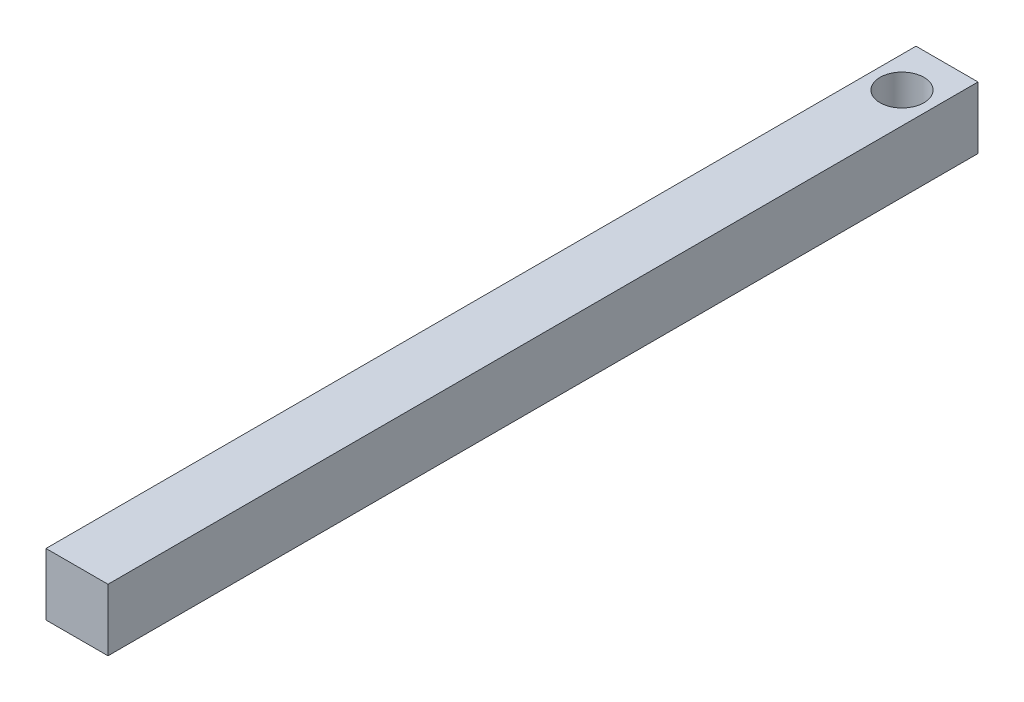
ISO-10303-21;
HEADER;
FILE_DESCRIPTION(('STEP AP214'),'2;1');
FILE_NAME('part.step','',(''),(''),'','','');
FILE_SCHEMA(('AUTOMOTIVE_DESIGN { 1 0 10303 214 1 1 1 1 }'));
ENDSEC;
DATA;
#1=APPLICATION_CONTEXT('core data for automotive mechanical design processes');
#2=APPLICATION_PROTOCOL_DEFINITION('international standard','automotive_design',2000,#1);
#3=PRODUCT_CONTEXT('',#1,'mechanical');
#4=PRODUCT('Part','Part','',(#3));
#5=PRODUCT_RELATED_PRODUCT_CATEGORY('part','',(#4));
#6=PRODUCT_DEFINITION_FORMATION('','',#4);
#7=PRODUCT_DEFINITION_CONTEXT('part definition',#1,'design');
#8=PRODUCT_DEFINITION('design','',#6,#7);
#9=PRODUCT_DEFINITION_SHAPE('','',#8);
#10=(LENGTH_UNIT() NAMED_UNIT(*) SI_UNIT(.MILLI.,.METRE.));
#11=(NAMED_UNIT(*) PLANE_ANGLE_UNIT() SI_UNIT($,.RADIAN.));
#12=(NAMED_UNIT(*) SI_UNIT($,.STERADIAN.) SOLID_ANGLE_UNIT());
#13=UNCERTAINTY_MEASURE_WITH_UNIT(LENGTH_MEASURE(1.E-05),#10,'distance_accuracy_value','');
#14=(GEOMETRIC_REPRESENTATION_CONTEXT(3) GLOBAL_UNCERTAINTY_ASSIGNED_CONTEXT((#13)) GLOBAL_UNIT_ASSIGNED_CONTEXT((#10,
#11,#12)) REPRESENTATION_CONTEXT('',''));
#15=CARTESIAN_POINT('',(0.,0.,0.));
#16=DIRECTION('',(0.,0.,1.));
#17=DIRECTION('',(1.,0.,0.));
#18=AXIS2_PLACEMENT_3D('',#15,#16,#17);
#19=CARTESIAN_POINT('',(-3.1,-3.1,90.));
#20=DIRECTION('',(1.,0.,0.));
#21=DIRECTION('',(0.,0.,-1.));
#22=AXIS2_PLACEMENT_3D('',#19,#20,#21);
#23=PLANE('',#22);
#24=DIRECTION('',(0.,0.,-1.));
#25=VECTOR('',#24,1.);
#26=CARTESIAN_POINT('',(-3.1,3.1,90.));
#27=LINE('',#26,#25);
#28=CARTESIAN_POINT('',(-3.1,3.1,90.));
#29=VERTEX_POINT('',#28);
#30=CARTESIAN_POINT('',(-3.1,3.1,3.00000000000003));
#31=VERTEX_POINT('',#30);
#32=EDGE_CURVE('E93',#29,#31,#27,.T.);
#33=ORIENTED_EDGE('',*,*,#32,.T.);
#34=DIRECTION('',(0.,1.,0.));
#35=VECTOR('',#34,1.);
#36=CARTESIAN_POINT('',(-3.1,-6.9,3.));
#37=LINE('',#36,#35);
#38=CARTESIAN_POINT('',(-3.1,-3.1,3.));
#39=VERTEX_POINT('',#38);
#40=EDGE_CURVE('E49',#39,#31,#37,.T.);
#41=ORIENTED_EDGE('',*,*,#40,.F.);
#42=DIRECTION('',(0.,0.,-1.));
#43=VECTOR('',#42,1.);
#44=CARTESIAN_POINT('',(-3.1,-3.1,90.));
#45=LINE('',#44,#43);
#46=CARTESIAN_POINT('',(-3.1,-3.1,90.));
#47=VERTEX_POINT('',#46);
#48=EDGE_CURVE('E11',#47,#39,#45,.T.);
#49=ORIENTED_EDGE('',*,*,#48,.F.);
#50=DIRECTION('',(0.,-1.,0.));
#51=VECTOR('',#50,1.);
#52=CARTESIAN_POINT('',(-3.1,-3.1,90.));
#53=LINE('',#52,#51);
#54=EDGE_CURVE('E102',#29,#47,#53,.T.);
#55=ORIENTED_EDGE('',*,*,#54,.F.);
#56=EDGE_LOOP('',(#33,#41,#49,#55));
#57=FACE_BOUND('',#56,.T.);
#58=ADVANCED_FACE('F35',(#57),#23,.F.);
#59=CARTESIAN_POINT('',(3.1,-3.1,90.));
#60=DIRECTION('',(0.,1.,0.));
#61=DIRECTION('',(0.,0.,1.));
#62=AXIS2_PLACEMENT_3D('',#59,#60,#61);
#63=PLANE('',#62);
#64=CARTESIAN_POINT('',(0.,-3.1,7.5));
#65=DIRECTION('',(0.,1.,0.));
#66=DIRECTION('',(0.,0.,1.));
#67=AXIS2_PLACEMENT_3D('',#64,#65,#66);
#68=CIRCLE('',#67,2.2);
#69=CARTESIAN_POINT('',(0.,-3.1,9.7));
#70=VERTEX_POINT('',#69);
#71=EDGE_CURVE('E90',#70,#70,#68,.T.);
#72=ORIENTED_EDGE('',*,*,#71,.T.);
#73=EDGE_LOOP('',(#72));
#74=FACE_BOUND('',#73,.T.);
#75=ORIENTED_EDGE('',*,*,#48,.T.);
#76=DIRECTION('',(1.,0.,0.));
#77=VECTOR('',#76,1.);
#78=CARTESIAN_POINT('',(3.1,-3.1,3.));
#79=LINE('',#78,#77);
#80=CARTESIAN_POINT('',(3.1,-3.1,3.));
#81=VERTEX_POINT('',#80);
#82=EDGE_CURVE('E104',#39,#81,#79,.T.);
#83=ORIENTED_EDGE('',*,*,#82,.T.);
#84=DIRECTION('',(0.,0.,-1.));
#85=VECTOR('',#84,1.);
#86=CARTESIAN_POINT('',(3.1,-3.1,90.));
#87=LINE('',#86,#85);
#88=CARTESIAN_POINT('',(3.1,-3.1,90.));
#89=VERTEX_POINT('',#88);
#90=EDGE_CURVE('E42',#89,#81,#87,.T.);
#91=ORIENTED_EDGE('',*,*,#90,.F.);
#92=DIRECTION('',(1.,0.,0.));
#93=VECTOR('',#92,1.);
#94=CARTESIAN_POINT('',(3.1,-3.1,90.));
#95=LINE('',#94,#93);
#96=EDGE_CURVE('E100',#47,#89,#95,.T.);
#97=ORIENTED_EDGE('',*,*,#96,.F.);
#98=EDGE_LOOP('',(#75,#83,#91,#97));
#99=FACE_BOUND('',#98,.T.);
#100=ADVANCED_FACE('F123',(#74,#99),#63,.F.);
#101=CARTESIAN_POINT('',(3.1,-3.1,90.));
#102=DIRECTION('',(-1.,0.,0.));
#103=DIRECTION('',(0.,0.,1.));
#104=AXIS2_PLACEMENT_3D('',#101,#102,#103);
#105=PLANE('',#104);
#106=ORIENTED_EDGE('',*,*,#90,.T.);
#107=DIRECTION('',(0.,1.,0.));
#108=VECTOR('',#107,1.);
#109=CARTESIAN_POINT('',(3.1,-6.9,3.));
#110=LINE('',#109,#108);
#111=CARTESIAN_POINT('',(3.1,3.1,3.));
#112=VERTEX_POINT('',#111);
#113=EDGE_CURVE('E76',#81,#112,#110,.T.);
#114=ORIENTED_EDGE('',*,*,#113,.T.);
#115=DIRECTION('',(0.,0.,-1.));
#116=VECTOR('',#115,1.);
#117=CARTESIAN_POINT('',(3.1,3.1,90.));
#118=LINE('',#117,#116);
#119=CARTESIAN_POINT('',(3.1,3.1,90.));
#120=VERTEX_POINT('',#119);
#121=EDGE_CURVE('E88',#120,#112,#118,.T.);
#122=ORIENTED_EDGE('',*,*,#121,.F.);
#123=DIRECTION('',(0.,1.,0.));
#124=VECTOR('',#123,1.);
#125=CARTESIAN_POINT('',(3.1,-3.1,90.));
#126=LINE('',#125,#124);
#127=EDGE_CURVE('E98',#89,#120,#126,.T.);
#128=ORIENTED_EDGE('',*,*,#127,.F.);
#129=EDGE_LOOP('',(#106,#114,#122,#128));
#130=FACE_BOUND('',#129,.T.);
#131=ADVANCED_FACE('F86',(#130),#105,.F.);
#132=CARTESIAN_POINT('',(3.1,3.1,90.));
#133=DIRECTION('',(0.,-1.,0.));
#134=DIRECTION('',(0.,0.,-1.));
#135=AXIS2_PLACEMENT_3D('',#132,#133,#134);
#136=PLANE('',#135);
#137=CARTESIAN_POINT('',(0.,3.1,7.5));
#138=DIRECTION('',(0.,1.,0.));
#139=DIRECTION('',(0.,0.,1.));
#140=AXIS2_PLACEMENT_3D('',#137,#138,#139);
#141=CIRCLE('',#140,2.2);
#142=CARTESIAN_POINT('',(0.,3.1,9.7));
#143=VERTEX_POINT('',#142);
#144=EDGE_CURVE('E81',#143,#143,#141,.T.);
#145=ORIENTED_EDGE('',*,*,#144,.F.);
#146=EDGE_LOOP('',(#145));
#147=FACE_BOUND('',#146,.T.);
#148=ORIENTED_EDGE('',*,*,#121,.T.);
#149=DIRECTION('',(1.,0.,0.));
#150=VECTOR('',#149,1.);
#151=CARTESIAN_POINT('',(0.,3.1,3.));
#152=LINE('',#151,#150);
#153=EDGE_CURVE('E73',#31,#112,#152,.T.);
#154=ORIENTED_EDGE('',*,*,#153,.F.);
#155=ORIENTED_EDGE('',*,*,#32,.F.);
#156=DIRECTION('',(-1.,0.,0.));
#157=VECTOR('',#156,1.);
#158=CARTESIAN_POINT('',(3.1,3.1,90.));
#159=LINE('',#158,#157);
#160=EDGE_CURVE('E57',#120,#29,#159,.T.);
#161=ORIENTED_EDGE('',*,*,#160,.F.);
#162=EDGE_LOOP('',(#148,#154,#155,#161));
#163=FACE_BOUND('',#162,.T.);
#164=ADVANCED_FACE('F92',(#147,#163),#136,.F.);
#165=CARTESIAN_POINT('',(0.,0.,90.));
#166=DIRECTION('',(0.,0.,1.));
#167=DIRECTION('',(1.,0.,0.));
#168=AXIS2_PLACEMENT_3D('',#165,#166,#167);
#169=PLANE('',#168);
#170=ORIENTED_EDGE('',*,*,#54,.T.);
#171=ORIENTED_EDGE('',*,*,#96,.T.);
#172=ORIENTED_EDGE('',*,*,#127,.T.);
#173=ORIENTED_EDGE('',*,*,#160,.T.);
#174=EDGE_LOOP('',(#170,#171,#172,#173));
#175=FACE_BOUND('',#174,.T.);
#176=ADVANCED_FACE('F116',(#175),#169,.T.);
#177=CARTESIAN_POINT('',(0.,-6.9,7.5));
#178=DIRECTION('',(0.,1.,0.));
#179=DIRECTION('',(0.,0.,1.));
#180=AXIS2_PLACEMENT_3D('',#177,#178,#179);
#181=CYLINDRICAL_SURFACE('',#180,2.2);
#182=ORIENTED_EDGE('',*,*,#144,.T.);
#183=EDGE_LOOP('',(#182));
#184=FACE_BOUND('',#183,.T.);
#185=ORIENTED_EDGE('',*,*,#71,.F.);
#186=EDGE_LOOP('',(#185));
#187=FACE_BOUND('',#186,.T.);
#188=ADVANCED_FACE('F112',(#184,#187),#181,.F.);
#189=CARTESIAN_POINT('',(0.,-6.9,3.));
#190=DIRECTION('',(0.,0.,1.));
#191=DIRECTION('',(1.,0.,0.));
#192=AXIS2_PLACEMENT_3D('',#189,#190,#191);
#193=PLANE('',#192);
#194=ORIENTED_EDGE('',*,*,#40,.T.);
#195=ORIENTED_EDGE('',*,*,#153,.T.);
#196=ORIENTED_EDGE('',*,*,#113,.F.);
#197=ORIENTED_EDGE('',*,*,#82,.F.);
#198=EDGE_LOOP('',(#194,#195,#196,#197));
#199=FACE_BOUND('',#198,.T.);
#200=ADVANCED_FACE('F75',(#199),#193,.F.);
#201=CLOSED_SHELL('',(#58,#100,#131,#164,#176,#188,#200));
#202=MANIFOLD_SOLID_BREP('B2',#201);
#203=ADVANCED_BREP_SHAPE_REPRESENTATION('',(#18,#202),#14);
#204=SHAPE_DEFINITION_REPRESENTATION(#9,#203);
ENDSEC;
END-ISO-10303-21;
